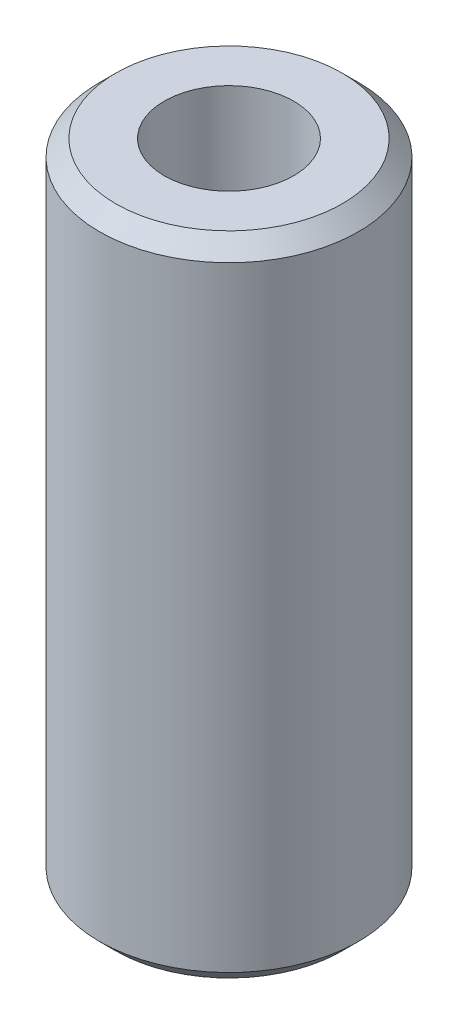
ISO-10303-21;
HEADER;
FILE_DESCRIPTION(('STEP AP214'),'2;1');
FILE_NAME('part.step','',(''),(''),'','','');
FILE_SCHEMA(('AUTOMOTIVE_DESIGN { 1 0 10303 214 1 1 1 1 }'));
ENDSEC;
DATA;
#1=APPLICATION_CONTEXT('core data for automotive mechanical design processes');
#2=APPLICATION_PROTOCOL_DEFINITION('international standard','automotive_design',2000,#1);
#3=PRODUCT_CONTEXT('',#1,'mechanical');
#4=PRODUCT('Part','Part','',(#3));
#5=PRODUCT_RELATED_PRODUCT_CATEGORY('part','',(#4));
#6=PRODUCT_DEFINITION_FORMATION('','',#4);
#7=PRODUCT_DEFINITION_CONTEXT('part definition',#1,'design');
#8=PRODUCT_DEFINITION('design','',#6,#7);
#9=PRODUCT_DEFINITION_SHAPE('','',#8);
#10=(LENGTH_UNIT() NAMED_UNIT(*) SI_UNIT(.MILLI.,.METRE.));
#11=(NAMED_UNIT(*) PLANE_ANGLE_UNIT() SI_UNIT($,.RADIAN.));
#12=(NAMED_UNIT(*) SI_UNIT($,.STERADIAN.) SOLID_ANGLE_UNIT());
#13=UNCERTAINTY_MEASURE_WITH_UNIT(LENGTH_MEASURE(1.E-05),#10,'distance_accuracy_value','');
#14=(GEOMETRIC_REPRESENTATION_CONTEXT(3) GLOBAL_UNCERTAINTY_ASSIGNED_CONTEXT((#13)) GLOBAL_UNIT_ASSIGNED_CONTEXT((#10,
#11,#12)) REPRESENTATION_CONTEXT('',''));
#15=CARTESIAN_POINT('',(0.,0.,0.));
#16=DIRECTION('',(0.,0.,1.));
#17=DIRECTION('',(1.,0.,0.));
#18=AXIS2_PLACEMENT_3D('',#15,#16,#17);
#19=CARTESIAN_POINT('',(0.,20.,0.));
#20=DIRECTION('',(0.,1.,0.));
#21=DIRECTION('',(0.,0.,1.));
#22=AXIS2_PLACEMENT_3D('',#19,#20,#21);
#23=PLANE('',#22);
#24=CARTESIAN_POINT('',(0.,20.,0.));
#25=DIRECTION('',(0.,1.,0.));
#26=DIRECTION('',(0.,0.,1.));
#27=AXIS2_PLACEMENT_3D('',#24,#25,#26);
#28=CIRCLE('',#27,3.5);
#29=CARTESIAN_POINT('',(0.,20.,3.5));
#30=VERTEX_POINT('',#29);
#31=EDGE_CURVE('E10',#30,#30,#28,.T.);
#32=ORIENTED_EDGE('',*,*,#31,.T.);
#33=EDGE_LOOP('',(#32));
#34=FACE_BOUND('',#33,.T.);
#35=CARTESIAN_POINT('',(0.,20.,0.));
#36=DIRECTION('',(0.,1.,0.));
#37=DIRECTION('',(0.,0.,1.));
#38=AXIS2_PLACEMENT_3D('',#35,#36,#37);
#39=CIRCLE('',#38,2.);
#40=CARTESIAN_POINT('',(0.,20.,2.));
#41=VERTEX_POINT('',#40);
#42=EDGE_CURVE('E55',#41,#41,#39,.T.);
#43=ORIENTED_EDGE('',*,*,#42,.F.);
#44=EDGE_LOOP('',(#43));
#45=FACE_BOUND('',#44,.T.);
#46=ADVANCED_FACE('F34',(#34,#45),#23,.T.);
#47=CARTESIAN_POINT('',(0.,0.,0.));
#48=DIRECTION('',(0.,1.,0.));
#49=DIRECTION('',(0.,0.,1.));
#50=AXIS2_PLACEMENT_3D('',#47,#48,#49);
#51=PLANE('',#50);
#52=CARTESIAN_POINT('',(0.,0.,0.));
#53=DIRECTION('',(0.,1.,0.));
#54=DIRECTION('',(0.,0.,1.));
#55=AXIS2_PLACEMENT_3D('',#52,#53,#54);
#56=CIRCLE('',#55,3.49999999999999);
#57=CARTESIAN_POINT('',(0.,0.,3.49999999999999));
#58=VERTEX_POINT('',#57);
#59=EDGE_CURVE('E42',#58,#58,#56,.F.);
#60=ORIENTED_EDGE('',*,*,#59,.T.);
#61=EDGE_LOOP('',(#60));
#62=FACE_BOUND('',#61,.T.);
#63=CARTESIAN_POINT('',(0.,0.,0.));
#64=DIRECTION('',(0.,1.,0.));
#65=DIRECTION('',(0.,0.,1.));
#66=AXIS2_PLACEMENT_3D('',#63,#64,#65);
#67=CIRCLE('',#66,2.);
#68=CARTESIAN_POINT('',(0.,0.,2.));
#69=VERTEX_POINT('',#68);
#70=EDGE_CURVE('E56',#69,#69,#67,.T.);
#71=ORIENTED_EDGE('',*,*,#70,.T.);
#72=EDGE_LOOP('',(#71));
#73=FACE_BOUND('',#72,.T.);
#74=ADVANCED_FACE('F66',(#62,#73),#51,.F.);
#75=CARTESIAN_POINT('',(0.,20.,0.));
#76=DIRECTION('',(0.,-1.,0.));
#77=DIRECTION('',(0.,0.,-1.));
#78=AXIS2_PLACEMENT_3D('',#75,#76,#77);
#79=CYLINDRICAL_SURFACE('',#78,4.);
#80=CARTESIAN_POINT('',(0.,0.500000000000011,0.));
#81=DIRECTION('',(0.,1.,0.));
#82=DIRECTION('',(0.,0.,1.));
#83=AXIS2_PLACEMENT_3D('',#80,#81,#82);
#84=CIRCLE('',#83,4.);
#85=CARTESIAN_POINT('',(0.,0.500000000000011,4.));
#86=VERTEX_POINT('',#85);
#87=EDGE_CURVE('E46',#86,#86,#84,.T.);
#88=ORIENTED_EDGE('',*,*,#87,.T.);
#89=EDGE_LOOP('',(#88));
#90=FACE_BOUND('',#89,.T.);
#91=CARTESIAN_POINT('',(0.,19.5,0.));
#92=DIRECTION('',(0.,1.,0.));
#93=DIRECTION('',(0.,0.,1.));
#94=AXIS2_PLACEMENT_3D('',#91,#92,#93);
#95=CIRCLE('',#94,4.);
#96=CARTESIAN_POINT('',(0.,19.5,4.));
#97=VERTEX_POINT('',#96);
#98=EDGE_CURVE('E50',#97,#97,#95,.F.);
#99=ORIENTED_EDGE('',*,*,#98,.T.);
#100=EDGE_LOOP('',(#99));
#101=FACE_BOUND('',#100,.T.);
#102=ADVANCED_FACE('F71',(#90,#101),#79,.T.);
#103=CARTESIAN_POINT('',(0.,20.,0.));
#104=DIRECTION('',(0.,-1.,0.));
#105=DIRECTION('',(0.,0.,-1.));
#106=AXIS2_PLACEMENT_3D('',#103,#104,#105);
#107=CYLINDRICAL_SURFACE('',#106,2.);
#108=ORIENTED_EDGE('',*,*,#42,.T.);
#109=EDGE_LOOP('',(#108));
#110=FACE_BOUND('',#109,.T.);
#111=ORIENTED_EDGE('',*,*,#70,.F.);
#112=EDGE_LOOP('',(#111));
#113=FACE_BOUND('',#112,.T.);
#114=ADVANCED_FACE('F62',(#110,#113),#107,.F.);
#115=CARTESIAN_POINT('',(0.,0.500000000000011,0.));
#116=DIRECTION('',(0.,1.,0.));
#117=DIRECTION('',(0.,0.,1.));
#118=AXIS2_PLACEMENT_3D('',#115,#116,#117);
#119=CONICAL_SURFACE('',#118,4.,0.785398163397452);
#120=ORIENTED_EDGE('',*,*,#59,.F.);
#121=EDGE_LOOP('',(#120));
#122=FACE_BOUND('',#121,.T.);
#123=ORIENTED_EDGE('',*,*,#87,.F.);
#124=EDGE_LOOP('',(#123));
#125=FACE_BOUND('',#124,.T.);
#126=ADVANCED_FACE('F78',(#122,#125),#119,.T.);
#127=CARTESIAN_POINT('',(0.,20.,0.));
#128=DIRECTION('',(0.,-1.,0.));
#129=DIRECTION('',(0.,0.,-1.));
#130=AXIS2_PLACEMENT_3D('',#127,#128,#129);
#131=CONICAL_SURFACE('',#130,3.5,0.785398163397445);
#132=ORIENTED_EDGE('',*,*,#98,.F.);
#133=EDGE_LOOP('',(#132));
#134=FACE_BOUND('',#133,.T.);
#135=ORIENTED_EDGE('',*,*,#31,.F.);
#136=EDGE_LOOP('',(#135));
#137=FACE_BOUND('',#136,.T.);
#138=ADVANCED_FACE('F37',(#134,#137),#131,.T.);
#139=CLOSED_SHELL('',(#46,#74,#102,#114,#126,#138));
#140=MANIFOLD_SOLID_BREP('B2',#139);
#141=ADVANCED_BREP_SHAPE_REPRESENTATION('',(#18,#140),#14);
#142=SHAPE_DEFINITION_REPRESENTATION(#9,#141);
ENDSEC;
END-ISO-10303-21;
